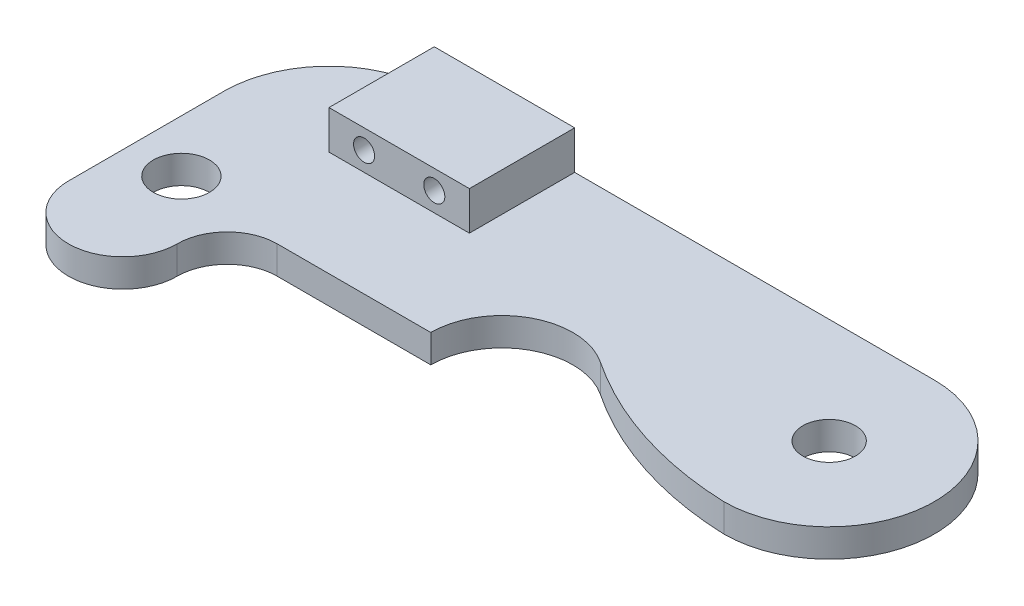
ISO-10303-21;
HEADER;
FILE_DESCRIPTION(('STEP AP214'),'2;1');
FILE_NAME('part.step','',(''),(''),'','','');
FILE_SCHEMA(('AUTOMOTIVE_DESIGN { 1 0 10303 214 1 1 1 1 }'));
ENDSEC;
DATA;
#1=APPLICATION_CONTEXT('core data for automotive mechanical design processes');
#2=APPLICATION_PROTOCOL_DEFINITION('international standard','automotive_design',2000,#1);
#3=PRODUCT_CONTEXT('',#1,'mechanical');
#4=PRODUCT('Part','Part','',(#3));
#5=PRODUCT_RELATED_PRODUCT_CATEGORY('part','',(#4));
#6=PRODUCT_DEFINITION_FORMATION('','',#4);
#7=PRODUCT_DEFINITION_CONTEXT('part definition',#1,'design');
#8=PRODUCT_DEFINITION('design','',#6,#7);
#9=PRODUCT_DEFINITION_SHAPE('','',#8);
#10=(LENGTH_UNIT() NAMED_UNIT(*) SI_UNIT(.MILLI.,.METRE.));
#11=(NAMED_UNIT(*) PLANE_ANGLE_UNIT() SI_UNIT($,.RADIAN.));
#12=(NAMED_UNIT(*) SI_UNIT($,.STERADIAN.) SOLID_ANGLE_UNIT());
#13=UNCERTAINTY_MEASURE_WITH_UNIT(LENGTH_MEASURE(1.E-05),#10,'distance_accuracy_value','');
#14=(GEOMETRIC_REPRESENTATION_CONTEXT(3) GLOBAL_UNCERTAINTY_ASSIGNED_CONTEXT((#13)) GLOBAL_UNIT_ASSIGNED_CONTEXT((#10,
#11,#12)) REPRESENTATION_CONTEXT('',''));
#15=CARTESIAN_POINT('',(0.,0.,0.));
#16=DIRECTION('',(0.,0.,1.));
#17=DIRECTION('',(1.,0.,0.));
#18=AXIS2_PLACEMENT_3D('',#15,#16,#17);
#19=CARTESIAN_POINT('',(33.0720854406885,1.6,0.));
#20=DIRECTION('',(1.,0.,0.));
#21=DIRECTION('',(0.,0.,-1.));
#22=AXIS2_PLACEMENT_3D('',#19,#20,#21);
#23=PLANE('',#22);
#24=DIRECTION('',(0.,0.,1.));
#25=VECTOR('',#24,1.);
#26=CARTESIAN_POINT('',(33.0720854406885,0.,0.));
#27=LINE('',#26,#25);
#28=CARTESIAN_POINT('',(33.0720854406885,0.,182.752493771732));
#29=VERTEX_POINT('',#28);
#30=CARTESIAN_POINT('',(33.0720854406885,0.,191.652493771732));
#31=VERTEX_POINT('',#30);
#32=EDGE_CURVE('E188',#29,#31,#27,.T.);
#33=ORIENTED_EDGE('',*,*,#32,.T.);
#34=DIRECTION('',(0.,-1.,0.));
#35=VECTOR('',#34,1.);
#36=CARTESIAN_POINT('',(33.0720854406885,1.6,191.652493771732));
#37=LINE('',#36,#35);
#38=CARTESIAN_POINT('',(33.0720854406885,1.6,191.652493771732));
#39=VERTEX_POINT('',#38);
#40=EDGE_CURVE('E225',#39,#31,#37,.T.);
#41=ORIENTED_EDGE('',*,*,#40,.F.);
#42=DIRECTION('',(0.,0.,1.));
#43=VECTOR('',#42,1.);
#44=CARTESIAN_POINT('',(33.0720854406885,1.6,0.));
#45=LINE('',#44,#43);
#46=CARTESIAN_POINT('',(33.0720854406885,1.6,182.752493771732));
#47=VERTEX_POINT('',#46);
#48=EDGE_CURVE('E165',#47,#39,#45,.T.);
#49=ORIENTED_EDGE('',*,*,#48,.F.);
#50=DIRECTION('',(0.,-1.,0.));
#51=VECTOR('',#50,1.);
#52=CARTESIAN_POINT('',(33.0720854406885,1.6,182.752493771732));
#53=LINE('',#52,#51);
#54=EDGE_CURVE('E184',#47,#29,#53,.T.);
#55=ORIENTED_EDGE('',*,*,#54,.T.);
#56=EDGE_LOOP('',(#33,#41,#49,#55));
#57=FACE_BOUND('',#56,.T.);
#58=ADVANCED_FACE('F34',(#57),#23,.F.);
#59=CARTESIAN_POINT('',(36.1720854406885,1.6,191.652493771732));
#60=DIRECTION('',(0.,-1.,0.));
#61=DIRECTION('',(0.,0.,-1.));
#62=AXIS2_PLACEMENT_3D('',#59,#60,#61);
#63=CYLINDRICAL_SURFACE('',#62,3.1);
#64=CARTESIAN_POINT('',(36.1720854406885,0.,191.652493771732));
#65=DIRECTION('',(0.,1.,0.));
#66=DIRECTION('',(0.,0.,1.));
#67=AXIS2_PLACEMENT_3D('',#64,#65,#66);
#68=CIRCLE('',#67,3.1);
#69=CARTESIAN_POINT('',(39.2720854406886,0.,191.652493771732));
#70=VERTEX_POINT('',#69);
#71=EDGE_CURVE('E191',#31,#70,#68,.T.);
#72=ORIENTED_EDGE('',*,*,#71,.T.);
#73=DIRECTION('',(0.,-1.,0.));
#74=VECTOR('',#73,1.);
#75=CARTESIAN_POINT('',(39.2720854406886,1.6,191.652493771732));
#76=LINE('',#75,#74);
#77=CARTESIAN_POINT('',(39.2720854406886,1.6,191.652493771732));
#78=VERTEX_POINT('',#77);
#79=EDGE_CURVE('E223',#78,#70,#76,.T.);
#80=ORIENTED_EDGE('',*,*,#79,.F.);
#81=CARTESIAN_POINT('',(36.1720854406885,1.6,191.652493771732));
#82=DIRECTION('',(0.,1.,0.));
#83=DIRECTION('',(0.,0.,1.));
#84=AXIS2_PLACEMENT_3D('',#81,#82,#83);
#85=CIRCLE('',#84,3.1);
#86=EDGE_CURVE('E168',#39,#78,#85,.T.);
#87=ORIENTED_EDGE('',*,*,#86,.F.);
#88=ORIENTED_EDGE('',*,*,#40,.T.);
#89=EDGE_LOOP('',(#72,#80,#87,#88));
#90=FACE_BOUND('',#89,.T.);
#91=ADVANCED_FACE('F230',(#90),#63,.T.);
#92=CARTESIAN_POINT('',(42.1220854406885,1.6,191.652493771732));
#93=DIRECTION('',(0.,-1.,0.));
#94=DIRECTION('',(0.,0.,-1.));
#95=AXIS2_PLACEMENT_3D('',#92,#93,#94);
#96=CYLINDRICAL_SURFACE('',#95,2.84999999999998);
#97=CARTESIAN_POINT('',(42.1220854406885,0.,191.652493771732));
#98=DIRECTION('',(0.,1.,0.));
#99=DIRECTION('',(0.,0.,1.));
#100=AXIS2_PLACEMENT_3D('',#97,#98,#99);
#101=CIRCLE('',#100,2.84999999999998);
#102=CARTESIAN_POINT('',(42.1220854406885,0.,188.802493771732));
#103=VERTEX_POINT('',#102);
#104=EDGE_CURVE('E194',#103,#70,#101,.T.);
#105=ORIENTED_EDGE('',*,*,#104,.F.);
#106=DIRECTION('',(0.,-1.,0.));
#107=VECTOR('',#106,1.);
#108=CARTESIAN_POINT('',(42.1220854406885,1.6,188.802493771732));
#109=LINE('',#108,#107);
#110=CARTESIAN_POINT('',(42.1220854406885,1.6,188.802493771732));
#111=VERTEX_POINT('',#110);
#112=EDGE_CURVE('E221',#111,#103,#109,.T.);
#113=ORIENTED_EDGE('',*,*,#112,.F.);
#114=CARTESIAN_POINT('',(42.1220854406885,1.6,191.652493771732));
#115=DIRECTION('',(0.,1.,0.));
#116=DIRECTION('',(0.,0.,1.));
#117=AXIS2_PLACEMENT_3D('',#114,#115,#116);
#118=CIRCLE('',#117,2.84999999999998);
#119=EDGE_CURVE('E170',#111,#78,#118,.T.);
#120=ORIENTED_EDGE('',*,*,#119,.T.);
#121=ORIENTED_EDGE('',*,*,#79,.T.);
#122=EDGE_LOOP('',(#105,#113,#120,#121));
#123=FACE_BOUND('',#122,.T.);
#124=ADVANCED_FACE('F242',(#123),#96,.F.);
#125=CARTESIAN_POINT('',(-5.98893930548641E-13,1.6,188.802493771732));
#126=DIRECTION('',(0.,0.,-1.));
#127=DIRECTION('',(-1.,0.,0.));
#128=AXIS2_PLACEMENT_3D('',#125,#126,#127);
#129=PLANE('',#128);
#130=DIRECTION('',(1.,0.,0.));
#131=VECTOR('',#130,1.);
#132=CARTESIAN_POINT('',(-5.98893930548641E-13,0.,188.802493771732));
#133=LINE('',#132,#131);
#134=CARTESIAN_POINT('',(50.8720854406885,0.,188.802493771732));
#135=VERTEX_POINT('',#134);
#136=EDGE_CURVE('E197',#103,#135,#133,.T.);
#137=ORIENTED_EDGE('',*,*,#136,.T.);
#138=DIRECTION('',(0.,-1.,0.));
#139=VECTOR('',#138,1.);
#140=CARTESIAN_POINT('',(50.8720854406885,1.6,188.802493771732));
#141=LINE('',#140,#139);
#142=CARTESIAN_POINT('',(50.8720854406885,1.6,188.802493771732));
#143=VERTEX_POINT('',#142);
#144=EDGE_CURVE('E218',#143,#135,#141,.T.);
#145=ORIENTED_EDGE('',*,*,#144,.F.);
#146=DIRECTION('',(1.,0.,0.));
#147=VECTOR('',#146,1.);
#148=CARTESIAN_POINT('',(-5.98893930548641E-13,1.6,188.802493771732));
#149=LINE('',#148,#147);
#150=EDGE_CURVE('E173',#111,#143,#149,.T.);
#151=ORIENTED_EDGE('',*,*,#150,.F.);
#152=ORIENTED_EDGE('',*,*,#112,.T.);
#153=EDGE_LOOP('',(#137,#145,#151,#152));
#154=FACE_BOUND('',#153,.T.);
#155=ADVANCED_FACE('F265',(#154),#129,.F.);
#156=CARTESIAN_POINT('',(54.9220854406885,1.6,188.802493771732));
#157=DIRECTION('',(0.,-1.,0.));
#158=DIRECTION('',(0.,0.,-1.));
#159=AXIS2_PLACEMENT_3D('',#156,#157,#158);
#160=CYLINDRICAL_SURFACE('',#159,4.05);
#161=CARTESIAN_POINT('',(54.9220854406885,0.,188.802493771732));
#162=DIRECTION('',(0.,1.,0.));
#163=DIRECTION('',(0.,0.,1.));
#164=AXIS2_PLACEMENT_3D('',#161,#162,#163);
#165=CIRCLE('',#164,4.05);
#166=CARTESIAN_POINT('',(57.1746759367006,0.,185.436734413537));
#167=VERTEX_POINT('',#166);
#168=EDGE_CURVE('E200',#167,#135,#165,.T.);
#169=ORIENTED_EDGE('',*,*,#168,.F.);
#170=DIRECTION('',(0.,-1.,0.));
#171=VECTOR('',#170,1.);
#172=CARTESIAN_POINT('',(57.1746759367006,1.6,185.436734413537));
#173=LINE('',#172,#171);
#174=CARTESIAN_POINT('',(57.1746759367006,1.6,185.436734413537));
#175=VERTEX_POINT('',#174);
#176=EDGE_CURVE('E42',#167,#175,#173,.F.);
#177=ORIENTED_EDGE('',*,*,#176,.T.);
#178=CARTESIAN_POINT('',(54.9220854406885,1.6,188.802493771732));
#179=DIRECTION('',(0.,1.,0.));
#180=DIRECTION('',(0.,0.,1.));
#181=AXIS2_PLACEMENT_3D('',#178,#179,#180);
#182=CIRCLE('',#181,4.05);
#183=EDGE_CURVE('E176',#175,#143,#182,.T.);
#184=ORIENTED_EDGE('',*,*,#183,.T.);
#185=ORIENTED_EDGE('',*,*,#144,.T.);
#186=EDGE_LOOP('',(#169,#177,#184,#185));
#187=FACE_BOUND('',#186,.T.);
#188=ADVANCED_FACE('F263',(#187),#160,.F.);
#189=CARTESIAN_POINT('',(67.5718771037381,1.6,182.802493771732));
#190=DIRECTION('',(0.,-1.,0.));
#191=DIRECTION('',(0.,0.,-1.));
#192=AXIS2_PLACEMENT_3D('',#189,#190,#191);
#193=CYLINDRICAL_SURFACE('',#192,6.00000000000001);
#194=CARTESIAN_POINT('',(67.5718771037381,0.,182.802493771732));
#195=DIRECTION('',(0.,1.,0.));
#196=DIRECTION('',(0.,0.,1.));
#197=AXIS2_PLACEMENT_3D('',#194,#195,#196);
#198=CIRCLE('',#197,6.00000000000001);
#199=CARTESIAN_POINT('',(67.5718771037381,0.,188.802493771732));
#200=VERTEX_POINT('',#199);
#201=CARTESIAN_POINT('',(67.5718771037381,0.,176.802493771732));
#202=VERTEX_POINT('',#201);
#203=EDGE_CURVE('E202',#200,#202,#198,.T.);
#204=ORIENTED_EDGE('',*,*,#203,.T.);
#205=DIRECTION('',(0.,-1.,0.));
#206=VECTOR('',#205,1.);
#207=CARTESIAN_POINT('',(67.5718771037381,1.6,176.802493771732));
#208=LINE('',#207,#206);
#209=CARTESIAN_POINT('',(67.5718771037381,1.6,176.802493771732));
#210=VERTEX_POINT('',#209);
#211=EDGE_CURVE('E213',#210,#202,#208,.T.);
#212=ORIENTED_EDGE('',*,*,#211,.F.);
#213=CARTESIAN_POINT('',(67.5718771037381,1.6,182.802493771732));
#214=DIRECTION('',(0.,1.,0.));
#215=DIRECTION('',(0.,0.,1.));
#216=AXIS2_PLACEMENT_3D('',#213,#214,#215);
#217=CIRCLE('',#216,6.00000000000001);
#218=CARTESIAN_POINT('',(67.5718771037381,1.6,188.802493771732));
#219=VERTEX_POINT('',#218);
#220=EDGE_CURVE('E178',#219,#210,#217,.T.);
#221=ORIENTED_EDGE('',*,*,#220,.F.);
#222=DIRECTION('',(0.,-1.,0.));
#223=VECTOR('',#222,1.);
#224=CARTESIAN_POINT('',(67.5718771037381,1.6,188.802493771732));
#225=LINE('',#224,#223);
#226=EDGE_CURVE('E215',#219,#200,#225,.T.);
#227=ORIENTED_EDGE('',*,*,#226,.T.);
#228=EDGE_LOOP('',(#204,#212,#221,#227));
#229=FACE_BOUND('',#228,.T.);
#230=ADVANCED_FACE('F258',(#229),#193,.T.);
#231=CARTESIAN_POINT('',(0.,1.6,176.802493771732));
#232=DIRECTION('',(0.,0.,-1.));
#233=DIRECTION('',(-1.,0.,0.));
#234=AXIS2_PLACEMENT_3D('',#231,#232,#233);
#235=PLANE('',#234);
#236=CARTESIAN_POINT('',(45.0718771037381,2.7,176.802493771732));
#237=DIRECTION('',(0.,0.,-1.));
#238=DIRECTION('',(-1.,0.,0.));
#239=AXIS2_PLACEMENT_3D('',#236,#237,#238);
#240=CIRCLE('',#239,0.600000000000001);
#241=CARTESIAN_POINT('',(44.4718771037381,2.7,176.802493771732));
#242=VERTEX_POINT('',#241);
#243=EDGE_CURVE('E445',#242,#242,#240,.T.);
#244=ORIENTED_EDGE('',*,*,#243,.F.);
#245=EDGE_LOOP('',(#244));
#246=FACE_BOUND('',#245,.T.);
#247=CARTESIAN_POINT('',(41.0718771037381,2.7,176.802493771732));
#248=DIRECTION('',(0.,0.,-1.));
#249=DIRECTION('',(-1.,0.,0.));
#250=AXIS2_PLACEMENT_3D('',#247,#248,#249);
#251=CIRCLE('',#250,0.600000000000001);
#252=CARTESIAN_POINT('',(40.4718771037381,2.7,176.802493771732));
#253=VERTEX_POINT('',#252);
#254=EDGE_CURVE('E446',#253,#253,#251,.T.);
#255=ORIENTED_EDGE('',*,*,#254,.F.);
#256=EDGE_LOOP('',(#255));
#257=FACE_BOUND('',#256,.T.);
#258=DIRECTION('',(1.,0.,0.));
#259=VECTOR('',#258,1.);
#260=CARTESIAN_POINT('',(0.,0.,176.802493771732));
#261=LINE('',#260,#259);
#262=CARTESIAN_POINT('',(39.0718771037381,0.,176.802493771732));
#263=VERTEX_POINT('',#262);
#264=EDGE_CURVE('E205',#263,#202,#261,.T.);
#265=ORIENTED_EDGE('',*,*,#264,.F.);
#266=DIRECTION('',(0.,-1.,0.));
#267=VECTOR('',#266,1.);
#268=CARTESIAN_POINT('',(39.0718771037381,1.6,176.802493771732));
#269=LINE('',#268,#267);
#270=CARTESIAN_POINT('',(39.0718771037381,1.6,176.802493771732));
#271=VERTEX_POINT('',#270);
#272=EDGE_CURVE('E211',#271,#263,#269,.T.);
#273=ORIENTED_EDGE('',*,*,#272,.F.);
#274=DIRECTION('',(0.,-1.,0.));
#275=VECTOR('',#274,1.);
#276=CARTESIAN_POINT('',(39.0718771037381,3.8,176.802493771732));
#277=LINE('',#276,#275);
#278=CARTESIAN_POINT('',(39.0718771037381,3.8,176.802493771732));
#279=VERTEX_POINT('',#278);
#280=EDGE_CURVE('E255',#279,#271,#277,.T.);
#281=ORIENTED_EDGE('',*,*,#280,.F.);
#282=DIRECTION('',(-1.,0.,0.));
#283=VECTOR('',#282,1.);
#284=CARTESIAN_POINT('',(39.0718771037381,3.8,176.802493771732));
#285=LINE('',#284,#283);
#286=CARTESIAN_POINT('',(47.0718771037381,3.8,176.802493771732));
#287=VERTEX_POINT('',#286);
#288=EDGE_CURVE('E141',#287,#279,#285,.T.);
#289=ORIENTED_EDGE('',*,*,#288,.F.);
#290=DIRECTION('',(0.,-1.,0.));
#291=VECTOR('',#290,1.);
#292=CARTESIAN_POINT('',(47.0718771037381,3.8,176.802493771732));
#293=LINE('',#292,#291);
#294=CARTESIAN_POINT('',(47.0718771037381,1.6,176.802493771732));
#295=VERTEX_POINT('',#294);
#296=EDGE_CURVE('E154',#287,#295,#293,.T.);
#297=ORIENTED_EDGE('',*,*,#296,.T.);
#298=DIRECTION('',(1.,0.,0.));
#299=VECTOR('',#298,1.);
#300=CARTESIAN_POINT('',(0.,1.6,176.802493771732));
#301=LINE('',#300,#299);
#302=EDGE_CURVE('E181',#295,#210,#301,.T.);
#303=ORIENTED_EDGE('',*,*,#302,.T.);
#304=ORIENTED_EDGE('',*,*,#211,.T.);
#305=EDGE_LOOP('',(#265,#273,#281,#289,#297,#303,#304));
#306=FACE_BOUND('',#305,.T.);
#307=ADVANCED_FACE('F254',(#246,#257,#306),#235,.T.);
#308=CARTESIAN_POINT('',(36.0529263646302,1.6,188.193770201141));
#309=DIRECTION('',(0.,-1.,0.));
#310=DIRECTION('',(0.,0.,-1.));
#311=AXIS2_PLACEMENT_3D('',#308,#309,#310);
#312=CYLINDRICAL_SURFACE('',#311,1.59999999999999);
#313=CARTESIAN_POINT('',(36.0529263646302,1.6,188.193770201141));
#314=DIRECTION('',(0.,1.,0.));
#315=DIRECTION('',(0.,0.,1.));
#316=AXIS2_PLACEMENT_3D('',#313,#314,#315);
#317=CIRCLE('',#316,1.59999999999999);
#318=CARTESIAN_POINT('',(36.0529263646302,1.6,189.793770201141));
#319=VERTEX_POINT('',#318);
#320=EDGE_CURVE('E161',#319,#319,#317,.T.);
#321=ORIENTED_EDGE('',*,*,#320,.T.);
#322=EDGE_LOOP('',(#321));
#323=FACE_BOUND('',#322,.T.);
#324=CARTESIAN_POINT('',(36.0529263646302,0.,188.193770201141));
#325=DIRECTION('',(0.,1.,0.));
#326=DIRECTION('',(0.,0.,1.));
#327=AXIS2_PLACEMENT_3D('',#324,#325,#326);
#328=CIRCLE('',#327,1.59999999999999);
#329=CARTESIAN_POINT('',(36.0529263646302,0.,189.793770201141));
#330=VERTEX_POINT('',#329);
#331=EDGE_CURVE('E152',#330,#330,#328,.T.);
#332=ORIENTED_EDGE('',*,*,#331,.F.);
#333=EDGE_LOOP('',(#332));
#334=FACE_BOUND('',#333,.T.);
#335=ADVANCED_FACE('F281',(#323,#334),#312,.F.);
#336=CARTESIAN_POINT('',(67.5718771037381,1.6,182.802493771732));
#337=DIRECTION('',(0.,-1.,0.));
#338=DIRECTION('',(0.,0.,-1.));
#339=AXIS2_PLACEMENT_3D('',#336,#337,#338);
#340=CYLINDRICAL_SURFACE('',#339,1.5);
#341=CARTESIAN_POINT('',(67.5718771037381,1.6,182.802493771732));
#342=DIRECTION('',(0.,1.,0.));
#343=DIRECTION('',(0.,0.,1.));
#344=AXIS2_PLACEMENT_3D('',#341,#342,#343);
#345=CIRCLE('',#344,1.5);
#346=CARTESIAN_POINT('',(67.5718771037381,1.6,184.302493771732));
#347=VERTEX_POINT('',#346);
#348=EDGE_CURVE('E158',#347,#347,#345,.T.);
#349=ORIENTED_EDGE('',*,*,#348,.T.);
#350=EDGE_LOOP('',(#349));
#351=FACE_BOUND('',#350,.T.);
#352=CARTESIAN_POINT('',(67.5718771037381,0.,182.802493771732));
#353=DIRECTION('',(0.,1.,0.));
#354=DIRECTION('',(0.,0.,1.));
#355=AXIS2_PLACEMENT_3D('',#352,#353,#354);
#356=CIRCLE('',#355,1.5);
#357=CARTESIAN_POINT('',(67.5718771037381,0.,184.302493771732));
#358=VERTEX_POINT('',#357);
#359=EDGE_CURVE('E149',#358,#358,#356,.T.);
#360=ORIENTED_EDGE('',*,*,#359,.F.);
#361=EDGE_LOOP('',(#360));
#362=FACE_BOUND('',#361,.T.);
#363=ADVANCED_FACE('F283',(#351,#362),#340,.F.);
#364=CARTESIAN_POINT('',(39.0718771037381,1.6,182.802493771732));
#365=DIRECTION('',(0.,-1.,0.));
#366=DIRECTION('',(0.,0.,-1.));
#367=AXIS2_PLACEMENT_3D('',#364,#365,#366);
#368=CYLINDRICAL_SURFACE('',#367,6.00000000000002);
#369=CARTESIAN_POINT('',(39.0718771037381,0.,182.802493771732));
#370=DIRECTION('',(0.,1.,0.));
#371=DIRECTION('',(0.,0.,1.));
#372=AXIS2_PLACEMENT_3D('',#369,#370,#371);
#373=CIRCLE('',#372,6.00000000000002);
#374=EDGE_CURVE('E162',#263,#29,#373,.T.);
#375=ORIENTED_EDGE('',*,*,#374,.T.);
#376=ORIENTED_EDGE('',*,*,#54,.F.);
#377=CARTESIAN_POINT('',(39.0718771037381,1.6,182.802493771732));
#378=DIRECTION('',(0.,1.,0.));
#379=DIRECTION('',(0.,0.,1.));
#380=AXIS2_PLACEMENT_3D('',#377,#378,#379);
#381=CIRCLE('',#380,6.00000000000002);
#382=EDGE_CURVE('E183',#271,#47,#381,.T.);
#383=ORIENTED_EDGE('',*,*,#382,.F.);
#384=ORIENTED_EDGE('',*,*,#272,.T.);
#385=EDGE_LOOP('',(#375,#376,#383,#384));
#386=FACE_BOUND('',#385,.T.);
#387=ADVANCED_FACE('F252',(#386),#368,.T.);
#388=CARTESIAN_POINT('',(0.,1.6,0.));
#389=DIRECTION('',(0.,1.,0.));
#390=DIRECTION('',(0.,0.,1.));
#391=AXIS2_PLACEMENT_3D('',#388,#389,#390);
#392=PLANE('',#391);
#393=ORIENTED_EDGE('',*,*,#183,.F.);
#394=CARTESIAN_POINT('',(68.2985796207109,1.6,168.815700545908));
#395=DIRECTION('',(0.,1.,0.));
#396=DIRECTION('',(0.,0.,1.));
#397=AXIS2_PLACEMENT_3D('',#394,#395,#396);
#398=CIRCLE('',#397,20.);
#399=EDGE_CURVE('E11',#175,#219,#398,.T.);
#400=ORIENTED_EDGE('',*,*,#399,.T.);
#401=ORIENTED_EDGE('',*,*,#220,.T.);
#402=ORIENTED_EDGE('',*,*,#302,.F.);
#403=DIRECTION('',(0.,0.,-1.));
#404=VECTOR('',#403,1.);
#405=CARTESIAN_POINT('',(47.0718771037381,1.6,176.802493771732));
#406=LINE('',#405,#404);
#407=CARTESIAN_POINT('',(47.0718771037381,1.6,182.802493771732));
#408=VERTEX_POINT('',#407);
#409=EDGE_CURVE('E145',#408,#295,#406,.T.);
#410=ORIENTED_EDGE('',*,*,#409,.F.);
#411=DIRECTION('',(1.,0.,0.));
#412=VECTOR('',#411,1.);
#413=CARTESIAN_POINT('',(39.0718771037381,1.6,182.802493771732));
#414=LINE('',#413,#412);
#415=CARTESIAN_POINT('',(39.0718771037381,1.6,182.802493771732));
#416=VERTEX_POINT('',#415);
#417=EDGE_CURVE('E456',#416,#408,#414,.T.);
#418=ORIENTED_EDGE('',*,*,#417,.F.);
#419=DIRECTION('',(0.,0.,1.));
#420=VECTOR('',#419,1.);
#421=CARTESIAN_POINT('',(39.0718771037381,1.6,176.802493771732));
#422=LINE('',#421,#420);
#423=EDGE_CURVE('E148',#271,#416,#422,.T.);
#424=ORIENTED_EDGE('',*,*,#423,.F.);
#425=ORIENTED_EDGE('',*,*,#382,.T.);
#426=ORIENTED_EDGE('',*,*,#48,.T.);
#427=ORIENTED_EDGE('',*,*,#86,.T.);
#428=ORIENTED_EDGE('',*,*,#119,.F.);
#429=ORIENTED_EDGE('',*,*,#150,.T.);
#430=EDGE_LOOP('',(#393,#400,#401,#402,#410,#418,#424,#425,#426,#427,#428,#429));
#431=FACE_BOUND('',#430,.T.);
#432=ORIENTED_EDGE('',*,*,#348,.F.);
#433=EDGE_LOOP('',(#432));
#434=FACE_BOUND('',#433,.T.);
#435=ORIENTED_EDGE('',*,*,#320,.F.);
#436=EDGE_LOOP('',(#435));
#437=FACE_BOUND('',#436,.T.);
#438=ADVANCED_FACE('F246',(#431,#434,#437),#392,.T.);
#439=CARTESIAN_POINT('',(0.,0.,0.));
#440=DIRECTION('',(0.,1.,0.));
#441=DIRECTION('',(0.,0.,1.));
#442=AXIS2_PLACEMENT_3D('',#439,#440,#441);
#443=PLANE('',#442);
#444=ORIENTED_EDGE('',*,*,#359,.T.);
#445=EDGE_LOOP('',(#444));
#446=FACE_BOUND('',#445,.T.);
#447=ORIENTED_EDGE('',*,*,#331,.T.);
#448=EDGE_LOOP('',(#447));
#449=FACE_BOUND('',#448,.T.);
#450=ORIENTED_EDGE('',*,*,#203,.F.);
#451=CARTESIAN_POINT('',(68.2985796207109,0.,168.815700545908));
#452=DIRECTION('',(0.,1.,0.));
#453=DIRECTION('',(0.,0.,1.));
#454=AXIS2_PLACEMENT_3D('',#451,#452,#453);
#455=CIRCLE('',#454,20.);
#456=EDGE_CURVE('E56',#200,#167,#455,.F.);
#457=ORIENTED_EDGE('',*,*,#456,.T.);
#458=ORIENTED_EDGE('',*,*,#168,.T.);
#459=ORIENTED_EDGE('',*,*,#136,.F.);
#460=ORIENTED_EDGE('',*,*,#104,.T.);
#461=ORIENTED_EDGE('',*,*,#71,.F.);
#462=ORIENTED_EDGE('',*,*,#32,.F.);
#463=ORIENTED_EDGE('',*,*,#374,.F.);
#464=ORIENTED_EDGE('',*,*,#264,.T.);
#465=EDGE_LOOP('',(#450,#457,#458,#459,#460,#461,#462,#463,#464));
#466=FACE_BOUND('',#465,.T.);
#467=ADVANCED_FACE('F237',(#446,#449,#466),#443,.F.);
#468=CARTESIAN_POINT('',(39.0718771037381,3.8,176.802493771732));
#469=DIRECTION('',(1.,0.,0.));
#470=DIRECTION('',(0.,0.,-1.));
#471=AXIS2_PLACEMENT_3D('',#468,#469,#470);
#472=PLANE('',#471);
#473=ORIENTED_EDGE('',*,*,#423,.T.);
#474=DIRECTION('',(0.,-1.,0.));
#475=VECTOR('',#474,1.);
#476=CARTESIAN_POINT('',(39.0718771037381,3.8,182.802493771732));
#477=LINE('',#476,#475);
#478=CARTESIAN_POINT('',(39.0718771037381,3.8,182.802493771732));
#479=VERTEX_POINT('',#478);
#480=EDGE_CURVE('E129',#479,#416,#477,.T.);
#481=ORIENTED_EDGE('',*,*,#480,.F.);
#482=DIRECTION('',(0.,0.,1.));
#483=VECTOR('',#482,1.);
#484=CARTESIAN_POINT('',(39.0718771037381,3.8,176.802493771732));
#485=LINE('',#484,#483);
#486=EDGE_CURVE('E136',#279,#479,#485,.T.);
#487=ORIENTED_EDGE('',*,*,#486,.F.);
#488=ORIENTED_EDGE('',*,*,#280,.T.);
#489=EDGE_LOOP('',(#473,#481,#487,#488));
#490=FACE_BOUND('',#489,.T.);
#491=ADVANCED_FACE('F147',(#490),#472,.F.);
#492=CARTESIAN_POINT('',(39.0718771037381,3.8,182.802493771732));
#493=DIRECTION('',(0.,0.,-1.));
#494=DIRECTION('',(-1.,0.,0.));
#495=AXIS2_PLACEMENT_3D('',#492,#493,#494);
#496=PLANE('',#495);
#497=CARTESIAN_POINT('',(45.0718771037381,2.7,182.802493771732));
#498=DIRECTION('',(0.,0.,-1.));
#499=DIRECTION('',(-1.,0.,0.));
#500=AXIS2_PLACEMENT_3D('',#497,#498,#499);
#501=CIRCLE('',#500,0.600000000000001);
#502=CARTESIAN_POINT('',(44.4718771037381,2.7,182.802493771732));
#503=VERTEX_POINT('',#502);
#504=EDGE_CURVE('E440',#503,#503,#501,.F.);
#505=ORIENTED_EDGE('',*,*,#504,.F.);
#506=EDGE_LOOP('',(#505));
#507=FACE_BOUND('',#506,.T.);
#508=CARTESIAN_POINT('',(41.0718771037381,2.7,182.802493771732));
#509=DIRECTION('',(0.,0.,-1.));
#510=DIRECTION('',(-1.,0.,0.));
#511=AXIS2_PLACEMENT_3D('',#508,#509,#510);
#512=CIRCLE('',#511,0.600000000000001);
#513=CARTESIAN_POINT('',(40.4718771037381,2.7,182.802493771732));
#514=VERTEX_POINT('',#513);
#515=EDGE_CURVE('E443',#514,#514,#512,.F.);
#516=ORIENTED_EDGE('',*,*,#515,.F.);
#517=EDGE_LOOP('',(#516));
#518=FACE_BOUND('',#517,.T.);
#519=ORIENTED_EDGE('',*,*,#417,.T.);
#520=DIRECTION('',(0.,-1.,0.));
#521=VECTOR('',#520,1.);
#522=CARTESIAN_POINT('',(47.0718771037381,3.8,182.802493771732));
#523=LINE('',#522,#521);
#524=CARTESIAN_POINT('',(47.0718771037381,3.8,182.802493771732));
#525=VERTEX_POINT('',#524);
#526=EDGE_CURVE('E132',#525,#408,#523,.T.);
#527=ORIENTED_EDGE('',*,*,#526,.F.);
#528=DIRECTION('',(1.,0.,0.));
#529=VECTOR('',#528,1.);
#530=CARTESIAN_POINT('',(39.0718771037381,3.8,182.802493771732));
#531=LINE('',#530,#529);
#532=EDGE_CURVE('E124',#479,#525,#531,.T.);
#533=ORIENTED_EDGE('',*,*,#532,.F.);
#534=ORIENTED_EDGE('',*,*,#480,.T.);
#535=EDGE_LOOP('',(#519,#527,#533,#534));
#536=FACE_BOUND('',#535,.T.);
#537=ADVANCED_FACE('F127',(#507,#518,#536),#496,.F.);
#538=CARTESIAN_POINT('',(47.0718771037381,3.8,176.802493771732));
#539=DIRECTION('',(-1.,0.,0.));
#540=DIRECTION('',(0.,0.,1.));
#541=AXIS2_PLACEMENT_3D('',#538,#539,#540);
#542=PLANE('',#541);
#543=ORIENTED_EDGE('',*,*,#409,.T.);
#544=ORIENTED_EDGE('',*,*,#296,.F.);
#545=DIRECTION('',(0.,0.,-1.));
#546=VECTOR('',#545,1.);
#547=CARTESIAN_POINT('',(47.0718771037381,3.8,176.802493771732));
#548=LINE('',#547,#546);
#549=EDGE_CURVE('E135',#525,#287,#548,.T.);
#550=ORIENTED_EDGE('',*,*,#549,.F.);
#551=ORIENTED_EDGE('',*,*,#526,.T.);
#552=EDGE_LOOP('',(#543,#544,#550,#551));
#553=FACE_BOUND('',#552,.T.);
#554=ADVANCED_FACE('F354',(#553),#542,.F.);
#555=CARTESIAN_POINT('',(0.,3.8,0.));
#556=DIRECTION('',(0.,1.,0.));
#557=DIRECTION('',(0.,0.,1.));
#558=AXIS2_PLACEMENT_3D('',#555,#556,#557);
#559=PLANE('',#558);
#560=ORIENTED_EDGE('',*,*,#486,.T.);
#561=ORIENTED_EDGE('',*,*,#532,.T.);
#562=ORIENTED_EDGE('',*,*,#549,.T.);
#563=ORIENTED_EDGE('',*,*,#288,.T.);
#564=EDGE_LOOP('',(#560,#561,#562,#563));
#565=FACE_BOUND('',#564,.T.);
#566=ADVANCED_FACE('F139',(#565),#559,.T.);
#567=CARTESIAN_POINT('',(41.0718771037381,2.7,194.753493771732));
#568=DIRECTION('',(0.,0.,-1.));
#569=DIRECTION('',(-1.,0.,0.));
#570=AXIS2_PLACEMENT_3D('',#567,#568,#569);
#571=CYLINDRICAL_SURFACE('',#570,0.600000000000001);
#572=ORIENTED_EDGE('',*,*,#254,.T.);
#573=EDGE_LOOP('',(#572));
#574=FACE_BOUND('',#573,.T.);
#575=ORIENTED_EDGE('',*,*,#515,.T.);
#576=EDGE_LOOP('',(#575));
#577=FACE_BOUND('',#576,.T.);
#578=ADVANCED_FACE('F366',(#574,#577),#571,.F.);
#579=CARTESIAN_POINT('',(45.0718771037381,2.7,194.753493771732));
#580=DIRECTION('',(0.,0.,-1.));
#581=DIRECTION('',(-1.,0.,0.));
#582=AXIS2_PLACEMENT_3D('',#579,#580,#581);
#583=CYLINDRICAL_SURFACE('',#582,0.600000000000001);
#584=ORIENTED_EDGE('',*,*,#243,.T.);
#585=EDGE_LOOP('',(#584));
#586=FACE_BOUND('',#585,.T.);
#587=ORIENTED_EDGE('',*,*,#504,.T.);
#588=EDGE_LOOP('',(#587));
#589=FACE_BOUND('',#588,.T.);
#590=ADVANCED_FACE('F376',(#586,#589),#583,.F.);
#591=CARTESIAN_POINT('',(68.2985796207109,1.6,168.815700545908));
#592=DIRECTION('',(0.,-1.,0.));
#593=DIRECTION('',(0.,0.,-1.));
#594=AXIS2_PLACEMENT_3D('',#591,#592,#593);
#595=CYLINDRICAL_SURFACE('',#594,20.);
#596=ORIENTED_EDGE('',*,*,#399,.F.);
#597=ORIENTED_EDGE('',*,*,#176,.F.);
#598=ORIENTED_EDGE('',*,*,#456,.F.);
#599=ORIENTED_EDGE('',*,*,#226,.F.);
#600=EDGE_LOOP('',(#596,#597,#598,#599));
#601=FACE_BOUND('',#600,.T.);
#602=ADVANCED_FACE('F36',(#601),#595,.T.);
#603=CLOSED_SHELL('',(#58,#91,#124,#155,#188,#230,#307,#335,#363,#387,#438,#467,#491,#537,#554,
#566,#578,#590,#602));
#604=MANIFOLD_SOLID_BREP('B2',#603);
#605=ADVANCED_BREP_SHAPE_REPRESENTATION('',(#18,#604),#14);
#606=SHAPE_DEFINITION_REPRESENTATION(#9,#605);
ENDSEC;
END-ISO-10303-21;
